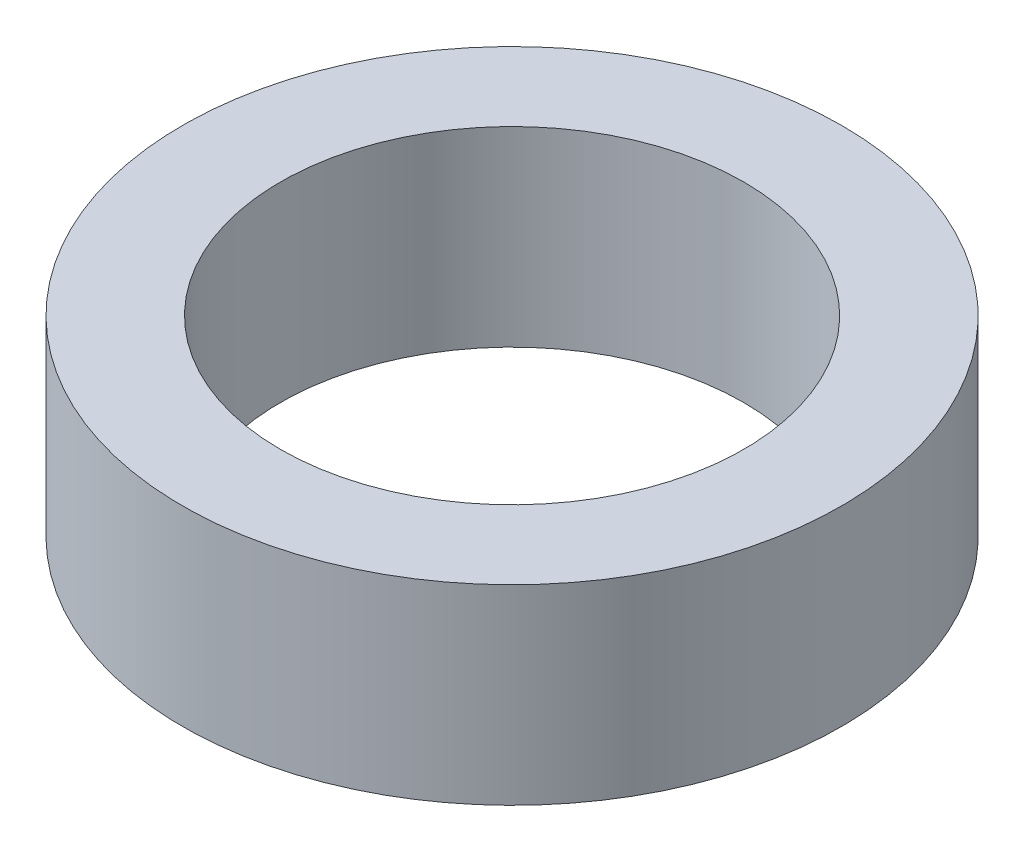
ISO-10303-21;
HEADER;
FILE_DESCRIPTION(('STEP AP214'),'2;1');
FILE_NAME('part.step','',(''),(''),'','','');
FILE_SCHEMA(('AUTOMOTIVE_DESIGN { 1 0 10303 214 1 1 1 1 }'));
ENDSEC;
DATA;
#1=APPLICATION_CONTEXT('core data for automotive mechanical design processes');
#2=APPLICATION_PROTOCOL_DEFINITION('international standard','automotive_design',2000,#1);
#3=PRODUCT_CONTEXT('',#1,'mechanical');
#4=PRODUCT('Part','Part','',(#3));
#5=PRODUCT_RELATED_PRODUCT_CATEGORY('part','',(#4));
#6=PRODUCT_DEFINITION_FORMATION('','',#4);
#7=PRODUCT_DEFINITION_CONTEXT('part definition',#1,'design');
#8=PRODUCT_DEFINITION('design','',#6,#7);
#9=PRODUCT_DEFINITION_SHAPE('','',#8);
#10=(LENGTH_UNIT() NAMED_UNIT(*) SI_UNIT(.MILLI.,.METRE.));
#11=(NAMED_UNIT(*) PLANE_ANGLE_UNIT() SI_UNIT($,.RADIAN.));
#12=(NAMED_UNIT(*) SI_UNIT($,.STERADIAN.) SOLID_ANGLE_UNIT());
#13=UNCERTAINTY_MEASURE_WITH_UNIT(LENGTH_MEASURE(1.E-05),#10,'distance_accuracy_value','');
#14=(GEOMETRIC_REPRESENTATION_CONTEXT(3) GLOBAL_UNCERTAINTY_ASSIGNED_CONTEXT((#13)) GLOBAL_UNIT_ASSIGNED_CONTEXT((#10,
#11,#12)) REPRESENTATION_CONTEXT('',''));
#15=CARTESIAN_POINT('',(0.,0.,0.));
#16=DIRECTION('',(0.,0.,1.));
#17=DIRECTION('',(1.,0.,0.));
#18=AXIS2_PLACEMENT_3D('',#15,#16,#17);
#19=CARTESIAN_POINT('',(0.,0.,0.));
#20=DIRECTION('',(0.,-1.,0.));
#21=DIRECTION('',(0.,0.,-1.));
#22=AXIS2_PLACEMENT_3D('',#19,#20,#21);
#23=CYLINDRICAL_SURFACE('',#22,69.);
#24=CARTESIAN_POINT('',(0.,0.,0.));
#25=DIRECTION('',(0.,-1.,0.));
#26=DIRECTION('',(0.,0.,-1.));
#27=AXIS2_PLACEMENT_3D('',#24,#25,#26);
#28=CIRCLE('',#27,69.);
#29=CARTESIAN_POINT('',(0.,0.,-69.));
#30=VERTEX_POINT('',#29);
#31=EDGE_CURVE('E47',#30,#30,#28,.T.);
#32=ORIENTED_EDGE('',*,*,#31,.F.);
#33=EDGE_LOOP('',(#32));
#34=FACE_BOUND('',#33,.T.);
#35=CARTESIAN_POINT('',(0.,40.,0.));
#36=DIRECTION('',(0.,-1.,0.));
#37=DIRECTION('',(0.,0.,-1.));
#38=AXIS2_PLACEMENT_3D('',#35,#36,#37);
#39=CIRCLE('',#38,69.);
#40=CARTESIAN_POINT('',(0.,40.,-69.));
#41=VERTEX_POINT('',#40);
#42=EDGE_CURVE('E10',#41,#41,#39,.T.);
#43=ORIENTED_EDGE('',*,*,#42,.T.);
#44=EDGE_LOOP('',(#43));
#45=FACE_BOUND('',#44,.T.);
#46=ADVANCED_FACE('F33',(#34,#45),#23,.T.);
#47=CARTESIAN_POINT('',(-69.,40.,0.));
#48=DIRECTION('',(0.,-1.,0.));
#49=DIRECTION('',(0.,0.,-1.));
#50=AXIS2_PLACEMENT_3D('',#47,#48,#49);
#51=PLANE('',#50);
#52=ORIENTED_EDGE('',*,*,#42,.F.);
#53=EDGE_LOOP('',(#52));
#54=FACE_BOUND('',#53,.T.);
#55=CARTESIAN_POINT('',(0.,40.,0.));
#56=DIRECTION('',(0.,-1.,0.));
#57=DIRECTION('',(0.,0.,-1.));
#58=AXIS2_PLACEMENT_3D('',#55,#56,#57);
#59=CIRCLE('',#58,48.5);
#60=CARTESIAN_POINT('',(0.,40.,-48.5));
#61=VERTEX_POINT('',#60);
#62=EDGE_CURVE('E39',#61,#61,#59,.T.);
#63=ORIENTED_EDGE('',*,*,#62,.T.);
#64=EDGE_LOOP('',(#63));
#65=FACE_BOUND('',#64,.T.);
#66=ADVANCED_FACE('F56',(#54,#65),#51,.F.);
#67=CARTESIAN_POINT('',(0.,0.,0.));
#68=DIRECTION('',(0.,-1.,0.));
#69=DIRECTION('',(0.,0.,-1.));
#70=AXIS2_PLACEMENT_3D('',#67,#68,#69);
#71=CYLINDRICAL_SURFACE('',#70,48.5);
#72=ORIENTED_EDGE('',*,*,#62,.F.);
#73=EDGE_LOOP('',(#72));
#74=FACE_BOUND('',#73,.T.);
#75=CARTESIAN_POINT('',(0.,0.,0.));
#76=DIRECTION('',(0.,-1.,0.));
#77=DIRECTION('',(0.,0.,-1.));
#78=AXIS2_PLACEMENT_3D('',#75,#76,#77);
#79=CIRCLE('',#78,48.5);
#80=CARTESIAN_POINT('',(0.,0.,-48.5));
#81=VERTEX_POINT('',#80);
#82=EDGE_CURVE('E43',#81,#81,#79,.T.);
#83=ORIENTED_EDGE('',*,*,#82,.T.);
#84=EDGE_LOOP('',(#83));
#85=FACE_BOUND('',#84,.T.);
#86=ADVANCED_FACE('F60',(#74,#85),#71,.F.);
#87=CARTESIAN_POINT('',(-48.5,0.,0.));
#88=DIRECTION('',(0.,1.,0.));
#89=DIRECTION('',(0.,0.,1.));
#90=AXIS2_PLACEMENT_3D('',#87,#88,#89);
#91=PLANE('',#90);
#92=ORIENTED_EDGE('',*,*,#82,.F.);
#93=EDGE_LOOP('',(#92));
#94=FACE_BOUND('',#93,.T.);
#95=ORIENTED_EDGE('',*,*,#31,.T.);
#96=EDGE_LOOP('',(#95));
#97=FACE_BOUND('',#96,.T.);
#98=ADVANCED_FACE('F53',(#94,#97),#91,.F.);
#99=CLOSED_SHELL('',(#46,#66,#86,#98));
#100=MANIFOLD_SOLID_BREP('B2',#99);
#101=ADVANCED_BREP_SHAPE_REPRESENTATION('',(#18,#100),#14);
#102=SHAPE_DEFINITION_REPRESENTATION(#9,#101);
ENDSEC;
END-ISO-10303-21;
